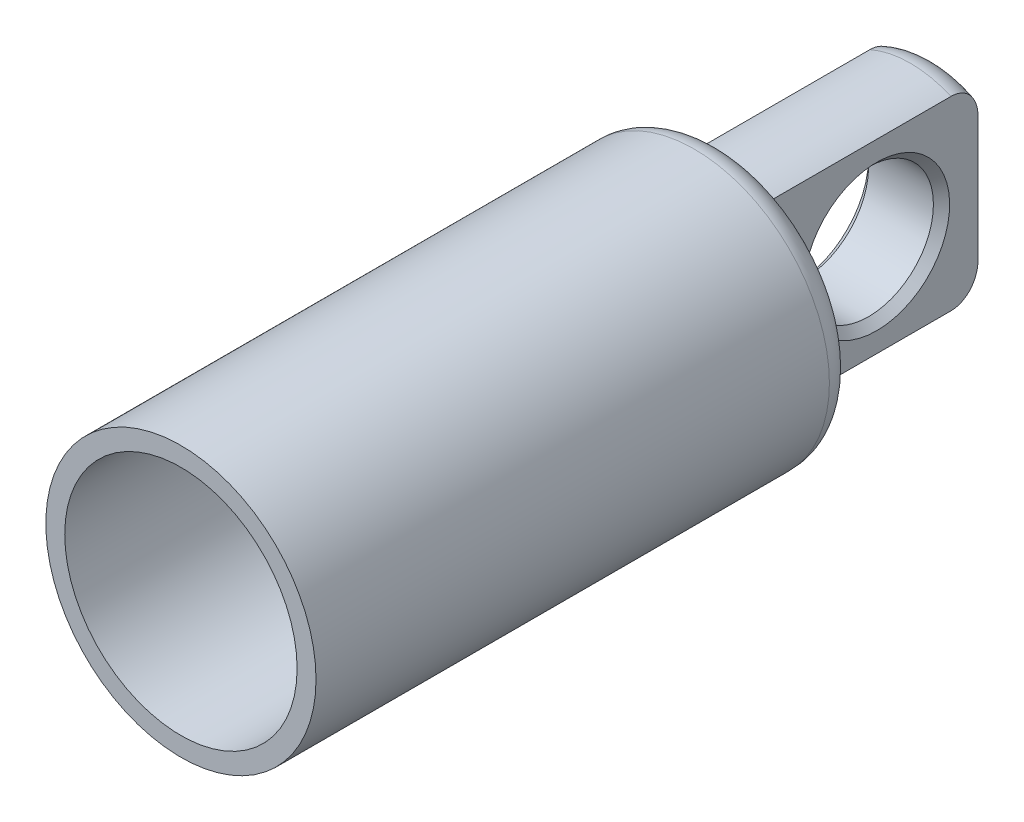
ISO-10303-21;
HEADER;
FILE_DESCRIPTION(('STEP AP214'),'2;1');
FILE_NAME('part.step','',(''),(''),'','','');
FILE_SCHEMA(('AUTOMOTIVE_DESIGN { 1 0 10303 214 1 1 1 1 }'));
ENDSEC;
DATA;
#1=APPLICATION_CONTEXT('core data for automotive mechanical design processes');
#2=APPLICATION_PROTOCOL_DEFINITION('international standard','automotive_design',2000,#1);
#3=PRODUCT_CONTEXT('',#1,'mechanical');
#4=PRODUCT('Part','Part','',(#3));
#5=PRODUCT_RELATED_PRODUCT_CATEGORY('part','',(#4));
#6=PRODUCT_DEFINITION_FORMATION('','',#4);
#7=PRODUCT_DEFINITION_CONTEXT('part definition',#1,'design');
#8=PRODUCT_DEFINITION('design','',#6,#7);
#9=PRODUCT_DEFINITION_SHAPE('','',#8);
#10=(LENGTH_UNIT() NAMED_UNIT(*) SI_UNIT(.MILLI.,.METRE.));
#11=(NAMED_UNIT(*) PLANE_ANGLE_UNIT() SI_UNIT($,.RADIAN.));
#12=(NAMED_UNIT(*) SI_UNIT($,.STERADIAN.) SOLID_ANGLE_UNIT());
#13=UNCERTAINTY_MEASURE_WITH_UNIT(LENGTH_MEASURE(1.E-05),#10,'distance_accuracy_value','');
#14=(GEOMETRIC_REPRESENTATION_CONTEXT(3) GLOBAL_UNCERTAINTY_ASSIGNED_CONTEXT((#13)) GLOBAL_UNIT_ASSIGNED_CONTEXT((#10,
#11,#12)) REPRESENTATION_CONTEXT('',''));
#15=CARTESIAN_POINT('',(0.,0.,0.));
#16=DIRECTION('',(0.,0.,1.));
#17=DIRECTION('',(1.,0.,0.));
#18=AXIS2_PLACEMENT_3D('',#15,#16,#17);
#19=CARTESIAN_POINT('',(0.,0.,-10.16));
#20=DIRECTION('',(0.,0.,1.));
#21=DIRECTION('',(1.,0.,0.));
#22=AXIS2_PLACEMENT_3D('',#19,#20,#21);
#23=CYLINDRICAL_SURFACE('',#22,4.7625);
#24=DIRECTION('',(0.,0.,-1.));
#25=VECTOR('',#24,1.);
#26=CARTESIAN_POINT('',(-1.905,-4.36490334944544,0.));
#27=LINE('',#26,#25);
#28=CARTESIAN_POINT('',(-1.905,-4.36490334944544,0.));
#29=VERTEX_POINT('',#28);
#30=CARTESIAN_POINT('',(-1.905,-4.36490334944544,-8.89));
#31=VERTEX_POINT('',#30);
#32=EDGE_CURVE('E207',#29,#31,#27,.T.);
#33=ORIENTED_EDGE('',*,*,#32,.T.);
#34=CARTESIAN_POINT('',(0.,0.,-8.89));
#35=DIRECTION('',(0.,0.,-1.));
#36=DIRECTION('',(-1.,0.,0.));
#37=AXIS2_PLACEMENT_3D('',#34,#35,#36);
#38=CIRCLE('',#37,4.7625);
#39=CARTESIAN_POINT('',(1.905,-4.36490334944544,-8.89));
#40=VERTEX_POINT('',#39);
#41=EDGE_CURVE('E60',#31,#40,#38,.F.);
#42=ORIENTED_EDGE('',*,*,#41,.T.);
#43=DIRECTION('',(0.,0.,-1.));
#44=VECTOR('',#43,1.);
#45=CARTESIAN_POINT('',(1.905,-4.36490334944544,0.));
#46=LINE('',#45,#44);
#47=CARTESIAN_POINT('',(1.905,-4.36490334944544,0.));
#48=VERTEX_POINT('',#47);
#49=EDGE_CURVE('E91',#48,#40,#46,.T.);
#50=ORIENTED_EDGE('',*,*,#49,.F.);
#51=CARTESIAN_POINT('',(0.,0.,0.));
#52=DIRECTION('',(0.,0.,1.));
#53=DIRECTION('',(1.,0.,0.));
#54=AXIS2_PLACEMENT_3D('',#51,#52,#53);
#55=CIRCLE('',#54,4.7625);
#56=EDGE_CURVE('E101',#48,#29,#55,.F.);
#57=ORIENTED_EDGE('',*,*,#56,.T.);
#58=EDGE_LOOP('',(#33,#42,#50,#57));
#59=FACE_BOUND('',#58,.T.);
#60=ADVANCED_FACE('F36',(#59),#23,.T.);
#61=CARTESIAN_POINT('',(0.,0.,25.4));
#62=DIRECTION('',(0.,0.,-1.));
#63=DIRECTION('',(-1.,0.,0.));
#64=AXIS2_PLACEMENT_3D('',#61,#62,#63);
#65=CYLINDRICAL_SURFACE('',#64,6.35);
#66=CARTESIAN_POINT('',(0.,0.,1.27));
#67=DIRECTION('',(0.,0.,1.));
#68=DIRECTION('',(1.,0.,0.));
#69=AXIS2_PLACEMENT_3D('',#66,#67,#68);
#70=CIRCLE('',#69,6.35);
#71=CARTESIAN_POINT('',(6.35,0.,1.27));
#72=VERTEX_POINT('',#71);
#73=EDGE_CURVE('E230',#72,#72,#70,.T.);
#74=ORIENTED_EDGE('',*,*,#73,.T.);
#75=EDGE_LOOP('',(#74));
#76=FACE_BOUND('',#75,.T.);
#77=CARTESIAN_POINT('',(0.,0.,25.4));
#78=DIRECTION('',(0.,0.,1.));
#79=DIRECTION('',(1.,0.,0.));
#80=AXIS2_PLACEMENT_3D('',#77,#78,#79);
#81=CIRCLE('',#80,6.35);
#82=CARTESIAN_POINT('',(6.35,0.,25.4));
#83=VERTEX_POINT('',#82);
#84=EDGE_CURVE('E228',#83,#83,#81,.T.);
#85=ORIENTED_EDGE('',*,*,#84,.F.);
#86=EDGE_LOOP('',(#85));
#87=FACE_BOUND('',#86,.T.);
#88=ADVANCED_FACE('F173',(#76,#87),#65,.T.);
#89=CARTESIAN_POINT('',(0.,0.,25.4));
#90=DIRECTION('',(0.,0.,1.));
#91=DIRECTION('',(1.,0.,0.));
#92=AXIS2_PLACEMENT_3D('',#89,#90,#91);
#93=PLANE('',#92);
#94=CARTESIAN_POINT('',(0.,0.,25.4));
#95=DIRECTION('',(0.,0.,1.));
#96=DIRECTION('',(1.,0.,0.));
#97=AXIS2_PLACEMENT_3D('',#94,#95,#96);
#98=CIRCLE('',#97,5.461);
#99=CARTESIAN_POINT('',(5.461,0.,25.4));
#100=VERTEX_POINT('',#99);
#101=EDGE_CURVE('E225',#100,#100,#98,.T.);
#102=ORIENTED_EDGE('',*,*,#101,.F.);
#103=EDGE_LOOP('',(#102));
#104=FACE_BOUND('',#103,.T.);
#105=ORIENTED_EDGE('',*,*,#84,.T.);
#106=EDGE_LOOP('',(#105));
#107=FACE_BOUND('',#106,.T.);
#108=ADVANCED_FACE('F170',(#104,#107),#93,.T.);
#109=CARTESIAN_POINT('',(0.,0.,0.));
#110=DIRECTION('',(0.,0.,1.));
#111=DIRECTION('',(1.,0.,0.));
#112=AXIS2_PLACEMENT_3D('',#109,#110,#111);
#113=PLANE('',#112);
#114=ORIENTED_EDGE('',*,*,#56,.F.);
#115=DIRECTION('',(0.,1.,0.));
#116=VECTOR('',#115,1.);
#117=CARTESIAN_POINT('',(1.905,4.36490334944544,0.));
#118=LINE('',#117,#116);
#119=CARTESIAN_POINT('',(1.905,4.36490334944544,0.));
#120=VERTEX_POINT('',#119);
#121=EDGE_CURVE('E89',#48,#120,#118,.T.);
#122=ORIENTED_EDGE('',*,*,#121,.T.);
#123=CARTESIAN_POINT('',(-1.905,4.36490334944544,0.));
#124=VERTEX_POINT('',#123);
#125=EDGE_CURVE('E108',#124,#120,#55,.F.);
#126=ORIENTED_EDGE('',*,*,#125,.F.);
#127=DIRECTION('',(0.,-1.,0.));
#128=VECTOR('',#127,1.);
#129=CARTESIAN_POINT('',(-1.905,4.36490334944544,0.));
#130=LINE('',#129,#128);
#131=EDGE_CURVE('E106',#124,#29,#130,.T.);
#132=ORIENTED_EDGE('',*,*,#131,.T.);
#133=EDGE_LOOP('',(#114,#122,#126,#132));
#134=FACE_BOUND('',#133,.T.);
#135=CARTESIAN_POINT('',(0.,0.,0.));
#136=DIRECTION('',(0.,0.,1.));
#137=DIRECTION('',(1.,0.,0.));
#138=AXIS2_PLACEMENT_3D('',#135,#136,#137);
#139=CIRCLE('',#138,5.08);
#140=CARTESIAN_POINT('',(5.08,0.,0.));
#141=VERTEX_POINT('',#140);
#142=EDGE_CURVE('E113',#141,#141,#139,.F.);
#143=ORIENTED_EDGE('',*,*,#142,.T.);
#144=EDGE_LOOP('',(#143));
#145=FACE_BOUND('',#144,.T.);
#146=ADVANCED_FACE('F104',(#134,#145),#113,.F.);
#147=CARTESIAN_POINT('',(0.,0.,25.4));
#148=DIRECTION('',(0.,0.,-1.));
#149=DIRECTION('',(-1.,0.,0.));
#150=AXIS2_PLACEMENT_3D('',#147,#148,#149);
#151=CYLINDRICAL_SURFACE('',#150,5.461);
#152=ORIENTED_EDGE('',*,*,#101,.T.);
#153=EDGE_LOOP('',(#152));
#154=FACE_BOUND('',#153,.T.);
#155=CARTESIAN_POINT('',(0.,0.,0.889000000000001));
#156=DIRECTION('',(0.,0.,1.));
#157=DIRECTION('',(1.,0.,0.));
#158=AXIS2_PLACEMENT_3D('',#155,#156,#157);
#159=CIRCLE('',#158,5.461);
#160=CARTESIAN_POINT('',(5.461,0.,0.889000000000001));
#161=VERTEX_POINT('',#160);
#162=EDGE_CURVE('E217',#161,#161,#159,.T.);
#163=ORIENTED_EDGE('',*,*,#162,.F.);
#164=EDGE_LOOP('',(#163));
#165=FACE_BOUND('',#164,.T.);
#166=ADVANCED_FACE('F162',(#154,#165),#151,.F.);
#167=CARTESIAN_POINT('',(0.,0.,0.889));
#168=DIRECTION('',(0.,0.,1.));
#169=DIRECTION('',(1.,0.,0.));
#170=AXIS2_PLACEMENT_3D('',#167,#168,#169);
#171=PLANE('',#170);
#172=ORIENTED_EDGE('',*,*,#162,.T.);
#173=EDGE_LOOP('',(#172));
#174=FACE_BOUND('',#173,.T.);
#175=ADVANCED_FACE('F165',(#174),#171,.T.);
#176=CARTESIAN_POINT('',(0.,0.,1.27));
#177=DIRECTION('',(0.,0.,1.));
#178=DIRECTION('',(1.,0.,0.));
#179=AXIS2_PLACEMENT_3D('',#176,#177,#178);
#180=TOROIDAL_SURFACE('',#179,5.08,1.27);
#181=ORIENTED_EDGE('',*,*,#142,.F.);
#182=EDGE_LOOP('',(#181));
#183=FACE_BOUND('',#182,.T.);
#184=ORIENTED_EDGE('',*,*,#73,.F.);
#185=EDGE_LOOP('',(#184));
#186=FACE_BOUND('',#185,.T.);
#187=ADVANCED_FACE('F160',(#183,#186),#180,.T.);
#188=DIRECTION('',(0.,0.,-1.));
#189=VECTOR('',#188,1.);
#190=CARTESIAN_POINT('',(1.905,4.36490334944544,0.));
#191=LINE('',#190,#189);
#192=CARTESIAN_POINT('',(1.905,4.36490334944544,-8.89));
#193=VERTEX_POINT('',#192);
#194=EDGE_CURVE('E93',#120,#193,#191,.T.);
#195=ORIENTED_EDGE('',*,*,#194,.T.);
#196=CARTESIAN_POINT('',(0.,0.,-8.89));
#197=DIRECTION('',(0.,0.,-1.));
#198=DIRECTION('',(-1.,0.,0.));
#199=AXIS2_PLACEMENT_3D('',#196,#197,#198);
#200=CIRCLE('',#199,4.7625);
#201=CARTESIAN_POINT('',(-1.905,4.36490334944544,-8.89));
#202=VERTEX_POINT('',#201);
#203=EDGE_CURVE('E11',#193,#202,#200,.F.);
#204=ORIENTED_EDGE('',*,*,#203,.T.);
#205=DIRECTION('',(0.,0.,-1.));
#206=VECTOR('',#205,1.);
#207=CARTESIAN_POINT('',(-1.905,4.36490334944544,0.));
#208=LINE('',#207,#206);
#209=EDGE_CURVE('E211',#124,#202,#208,.T.);
#210=ORIENTED_EDGE('',*,*,#209,.F.);
#211=ORIENTED_EDGE('',*,*,#125,.T.);
#212=EDGE_LOOP('',(#195,#204,#210,#211));
#213=FACE_BOUND('',#212,.T.);
#214=ADVANCED_FACE('F156',(#213),#23,.T.);
#215=CARTESIAN_POINT('',(0.,0.,-10.16));
#216=DIRECTION('',(0.,0.,-1.));
#217=DIRECTION('',(-1.,0.,0.));
#218=AXIS2_PLACEMENT_3D('',#215,#216,#217);
#219=PLANE('',#218);
#220=DIRECTION('',(0.,1.,0.));
#221=VECTOR('',#220,1.);
#222=CARTESIAN_POINT('',(1.905,4.36490334944544,-10.16));
#223=LINE('',#222,#221);
#224=CARTESIAN_POINT('',(1.905,-2.92720536519049,-10.16));
#225=VERTEX_POINT('',#224);
#226=CARTESIAN_POINT('',(1.905,2.92720536519049,-10.16));
#227=VERTEX_POINT('',#226);
#228=EDGE_CURVE('E98',#225,#227,#223,.T.);
#229=ORIENTED_EDGE('',*,*,#228,.F.);
#230=CARTESIAN_POINT('',(0.,0.,-10.16));
#231=DIRECTION('',(0.,0.,-1.));
#232=DIRECTION('',(-1.,0.,0.));
#233=AXIS2_PLACEMENT_3D('',#230,#231,#232);
#234=CIRCLE('',#233,3.4925);
#235=CARTESIAN_POINT('',(-1.905,-2.92720536519049,-10.16));
#236=VERTEX_POINT('',#235);
#237=EDGE_CURVE('E128',#225,#236,#234,.T.);
#238=ORIENTED_EDGE('',*,*,#237,.T.);
#239=DIRECTION('',(0.,-1.,0.));
#240=VECTOR('',#239,1.);
#241=CARTESIAN_POINT('',(-1.905,4.36490334944544,-10.16));
#242=LINE('',#241,#240);
#243=CARTESIAN_POINT('',(-1.905,2.92720536519049,-10.16));
#244=VERTEX_POINT('',#243);
#245=EDGE_CURVE('E209',#244,#236,#242,.T.);
#246=ORIENTED_EDGE('',*,*,#245,.F.);
#247=CARTESIAN_POINT('',(0.,0.,-10.16));
#248=DIRECTION('',(0.,0.,-1.));
#249=DIRECTION('',(-1.,0.,0.));
#250=AXIS2_PLACEMENT_3D('',#247,#248,#249);
#251=CIRCLE('',#250,3.4925);
#252=EDGE_CURVE('E125',#244,#227,#251,.T.);
#253=ORIENTED_EDGE('',*,*,#252,.T.);
#254=EDGE_LOOP('',(#229,#238,#246,#253));
#255=FACE_BOUND('',#254,.T.);
#256=ADVANCED_FACE('F149',(#255),#219,.T.);
#257=CARTESIAN_POINT('',(-1.905,4.36490334944544,0.));
#258=DIRECTION('',(1.,0.,0.));
#259=DIRECTION('',(0.,1.,0.));
#260=AXIS2_PLACEMENT_3D('',#257,#258,#259);
#261=PLANE('',#260);
#262=CARTESIAN_POINT('',(-1.905,0.,-5.3975));
#263=DIRECTION('',(1.,0.,0.));
#264=DIRECTION('',(0.,1.,0.));
#265=AXIS2_PLACEMENT_3D('',#262,#263,#264);
#266=CIRCLE('',#265,3.429);
#267=CARTESIAN_POINT('',(-1.905,3.429,-5.3975));
#268=VERTEX_POINT('',#267);
#269=EDGE_CURVE('E107',#268,#268,#266,.T.);
#270=ORIENTED_EDGE('',*,*,#269,.T.);
#271=EDGE_LOOP('',(#270));
#272=FACE_BOUND('',#271,.T.);
#273=ORIENTED_EDGE('',*,*,#245,.T.);
#274=CARTESIAN_POINT('',(-1.905,-2.92720536519049,-10.16));
#275=CARTESIAN_POINT('',(-1.905,-2.98132402105541,-10.1600064832095));
#276=CARTESIAN_POINT('',(-1.905,-3.03546640915894,-10.1575694277126));
#277=CARTESIAN_POINT('',(-1.905,-3.14337038378051,-10.147600787364));
#278=CARTESIAN_POINT('',(-1.905,-3.19713115345611,-10.1400604319878));
#279=CARTESIAN_POINT('',(-1.905,-3.30381074626772,-10.1196462465851));
#280=CARTESIAN_POINT('',(-1.905,-3.35672661587625,-10.1067567396132));
#281=CARTESIAN_POINT('',(-1.905,-3.46087340765745,-10.0755358837916));
#282=CARTESIAN_POINT('',(-1.905,-3.51210576523154,-10.0572093118652));
#283=CARTESIAN_POINT('',(-1.905,-3.63377839124686,-10.0059866506064));
#284=CARTESIAN_POINT('',(-1.905,-3.70303952694985,-9.97021263677757));
#285=CARTESIAN_POINT('',(-1.905,-3.83451020752514,-9.88771868456725));
#286=CARTESIAN_POINT('',(-1.905,-3.89673567753279,-9.84102423131769));
#287=CARTESIAN_POINT('',(-1.905,-4.01235640306473,-9.73713293052762));
#288=CARTESIAN_POINT('',(-1.905,-4.06570386564284,-9.67988252894815));
#289=CARTESIAN_POINT('',(-1.905,-4.16092021285018,-9.55641047586642));
#290=CARTESIAN_POINT('',(-1.905,-4.20278291350322,-9.49018401976242));
#291=CARTESIAN_POINT('',(-1.905,-4.26985685386264,-9.35715368823077));
#292=CARTESIAN_POINT('',(-1.905,-4.29622038509427,-9.29092834996992));
#293=CARTESIAN_POINT('',(-1.905,-4.33658892991174,-9.15489125363754));
#294=CARTESIAN_POINT('',(-1.905,-4.35062151379467,-9.0850878676247));
#295=CARTESIAN_POINT('',(-1.905,-4.36043965484168,-8.99397786798046));
#296=CARTESIAN_POINT('',(-1.905,-4.36211401183235,-8.9732011982541));
#297=CARTESIAN_POINT('',(-1.905,-4.36434422473604,-8.93161949765128));
#298=CARTESIAN_POINT('',(-1.905,-4.36490177407431,-8.91081455765388));
#299=CARTESIAN_POINT('',(-1.905,-4.36490334944546,-8.89));
#300=B_SPLINE_CURVE_WITH_KNOTS('',3,(#274,#275,#276,#277,#278,#279,#280,#281,#282,#283,#284,
#285,#286,#287,#288,#289,#290,#291,#292,#293,#294,#295,#296,#297,#298,#299),.UNSPECIFIED.,.F.,
.F.,(4,2,2,2,2,2,2,2,2,2,2,2,4),(0.,0.162335826820369,0.324951354612323,0.488046869242433,
0.650999512834123,0.883796058421268,1.11605465223082,1.34952572611191,1.58312226697818,
1.79588027556207,2.00816136727746,2.07067322340408,2.13309022028259),.UNSPECIFIED.);
#301=EDGE_CURVE('E138',#236,#31,#300,.T.);
#302=ORIENTED_EDGE('',*,*,#301,.T.);
#303=ORIENTED_EDGE('',*,*,#32,.F.);
#304=ORIENTED_EDGE('',*,*,#131,.F.);
#305=ORIENTED_EDGE('',*,*,#209,.T.);
#306=CARTESIAN_POINT('',(-1.905,4.36490334944544,-8.89));
#307=CARTESIAN_POINT('',(-1.905,4.36490422359483,-8.92339919910838));
#308=CARTESIAN_POINT('',(-1.905,4.36346480508041,-8.95678177763765));
#309=CARTESIAN_POINT('',(-1.905,4.35772999076058,-9.02329490045136));
#310=CARTESIAN_POINT('',(-1.905,4.35343509534946,-9.05642548786607));
#311=CARTESIAN_POINT('',(-1.905,4.33634337546593,-9.15489806950019));
#312=CARTESIAN_POINT('',(-1.905,4.31933911241619,-9.21955802636618));
#313=CARTESIAN_POINT('',(-1.905,4.27475667885088,-9.34506168882081));
#314=CARTESIAN_POINT('',(-1.905,4.24717995463365,-9.40590591507211));
#315=CARTESIAN_POINT('',(-1.905,4.1824556513036,-9.52228788782987));
#316=CARTESIAN_POINT('',(-1.905,4.14530451663396,-9.57782365245797));
#317=CARTESIAN_POINT('',(-1.905,4.06158354676759,-9.6837275420454));
#318=CARTESIAN_POINT('',(-1.905,4.01478585752914,-9.73391495783361));
#319=CARTESIAN_POINT('',(-1.905,3.91397899782167,-9.8263799471498));
#320=CARTESIAN_POINT('',(-1.905,3.85996996730527,-9.8686576741452));
#321=CARTESIAN_POINT('',(-1.905,3.74194657661533,-9.94764916451322));
#322=CARTESIAN_POINT('',(-1.905,3.6774828837546,-9.98368986955687));
#323=CARTESIAN_POINT('',(-1.905,3.54380992591659,-10.0457069429606));
#324=CARTESIAN_POINT('',(-1.905,3.47459377568292,-10.0716683304353));
#325=CARTESIAN_POINT('',(-1.905,3.32657767116101,-10.1155078617819));
#326=CARTESIAN_POINT('',(-1.905,3.2474882057244,-10.1323976470139));
#327=CARTESIAN_POINT('',(-1.905,3.08795205769954,-10.1546476910731));
#328=CARTESIAN_POINT('',(-1.905,3.0075107274282,-10.1600458876112));
#329=CARTESIAN_POINT('',(-1.905,2.92720536519049,-10.16));
#330=B_SPLINE_CURVE_WITH_KNOTS('',3,(#306,#307,#308,#309,#310,#311,#312,#313,#314,#315,#316,
#317,#318,#319,#320,#321,#322,#323,#324,#325,#326,#327,#328,#329),.UNSPECIFIED.,.F.,.F.,(4,2,2,
2,2,2,2,2,2,2,2,4),(0.,0.100133888262804,0.20025023366848,0.399780863197951,0.599284206941912,
0.79886174535297,1.00384490895569,1.20882409496814,1.42948410837142,1.65047084446328,
1.89221565367468,2.13316113395296),.UNSPECIFIED.);
#331=EDGE_CURVE('E131',#202,#244,#330,.T.);
#332=ORIENTED_EDGE('',*,*,#331,.T.);
#333=EDGE_LOOP('',(#273,#302,#303,#304,#305,#332));
#334=FACE_BOUND('',#333,.T.);
#335=ADVANCED_FACE('F144',(#272,#334),#261,.F.);
#336=CARTESIAN_POINT('',(1.905,4.36490334944544,0.));
#337=DIRECTION('',(-1.,0.,0.));
#338=DIRECTION('',(0.,-1.,0.));
#339=AXIS2_PLACEMENT_3D('',#336,#337,#338);
#340=PLANE('',#339);
#341=CARTESIAN_POINT('',(1.905,0.,-5.3975));
#342=DIRECTION('',(-1.,0.,0.));
#343=DIRECTION('',(0.,-1.,0.));
#344=AXIS2_PLACEMENT_3D('',#341,#342,#343);
#345=CIRCLE('',#344,3.42900000000001);
#346=CARTESIAN_POINT('',(1.905,-3.42900000000001,-5.3975));
#347=VERTEX_POINT('',#346);
#348=EDGE_CURVE('E122',#347,#347,#345,.T.);
#349=ORIENTED_EDGE('',*,*,#348,.T.);
#350=EDGE_LOOP('',(#349));
#351=FACE_BOUND('',#350,.T.);
#352=ORIENTED_EDGE('',*,*,#49,.T.);
#353=CARTESIAN_POINT('',(1.905,-4.36490334944544,-8.89));
#354=CARTESIAN_POINT('',(1.905,-4.36490422359483,-8.92339919910838));
#355=CARTESIAN_POINT('',(1.905,-4.36346480508041,-8.95678177763766));
#356=CARTESIAN_POINT('',(1.905,-4.35772999076058,-9.02329490045136));
#357=CARTESIAN_POINT('',(1.905,-4.35343509534946,-9.05642548786607));
#358=CARTESIAN_POINT('',(1.905,-4.33634337546593,-9.15489806950019));
#359=CARTESIAN_POINT('',(1.905,-4.31933911241619,-9.21955802636618));
#360=CARTESIAN_POINT('',(1.905,-4.27475667885088,-9.34506168882081));
#361=CARTESIAN_POINT('',(1.905,-4.24717995463365,-9.40590591507211));
#362=CARTESIAN_POINT('',(1.905,-4.1824556513036,-9.52228788782987));
#363=CARTESIAN_POINT('',(1.905,-4.14530451663395,-9.57782365245797));
#364=CARTESIAN_POINT('',(1.905,-4.06158354676759,-9.6837275420454));
#365=CARTESIAN_POINT('',(1.905,-4.01478585752914,-9.73391495783361));
#366=CARTESIAN_POINT('',(1.905,-3.91397899782167,-9.8263799471498));
#367=CARTESIAN_POINT('',(1.905,-3.85996996730528,-9.8686576741452));
#368=CARTESIAN_POINT('',(1.905,-3.74194657661533,-9.94764916451322));
#369=CARTESIAN_POINT('',(1.905,-3.6774828837546,-9.98368986955687));
#370=CARTESIAN_POINT('',(1.905,-3.54380992591659,-10.0457069429606));
#371=CARTESIAN_POINT('',(1.905,-3.47459377568293,-10.0716683304353));
#372=CARTESIAN_POINT('',(1.905,-3.32657767116101,-10.1155078617819));
#373=CARTESIAN_POINT('',(1.905,-3.2474882057244,-10.1323976470139));
#374=CARTESIAN_POINT('',(1.905,-3.08795205769954,-10.1546476910731));
#375=CARTESIAN_POINT('',(1.905,-3.0075107274282,-10.1600458876112));
#376=CARTESIAN_POINT('',(1.905,-2.92720536519049,-10.16));
#377=B_SPLINE_CURVE_WITH_KNOTS('',3,(#353,#354,#355,#356,#357,#358,#359,#360,#361,#362,#363,
#364,#365,#366,#367,#368,#369,#370,#371,#372,#373,#374,#375,#376),.UNSPECIFIED.,.F.,.F.,(4,2,2,
2,2,2,2,2,2,2,2,4),(0.,0.100133888262806,0.200250233668484,0.399780863197951,0.599284206941912,
0.798861745352971,1.00384490895569,1.20882409496814,1.42948410837142,1.65047084446328,
1.89221565367468,2.13316113395296),.UNSPECIFIED.);
#378=EDGE_CURVE('E45',#40,#225,#377,.T.);
#379=ORIENTED_EDGE('',*,*,#378,.T.);
#380=ORIENTED_EDGE('',*,*,#228,.T.);
#381=CARTESIAN_POINT('',(1.905,2.92720536519049,-10.16));
#382=CARTESIAN_POINT('',(1.905,2.98132402105541,-10.1600064832095));
#383=CARTESIAN_POINT('',(1.905,3.03546640915894,-10.1575694277126));
#384=CARTESIAN_POINT('',(1.905,3.14337038378051,-10.147600787364));
#385=CARTESIAN_POINT('',(1.905,3.19713115345611,-10.1400604319878));
#386=CARTESIAN_POINT('',(1.905,3.30381074626772,-10.1196462465851));
#387=CARTESIAN_POINT('',(1.905,3.35672661587625,-10.1067567396132));
#388=CARTESIAN_POINT('',(1.905,3.46087340765745,-10.0755358837916));
#389=CARTESIAN_POINT('',(1.905,3.51210576523154,-10.0572093118652));
#390=CARTESIAN_POINT('',(1.905,3.63377839124686,-10.0059866506064));
#391=CARTESIAN_POINT('',(1.905,3.70303952694985,-9.97021263677757));
#392=CARTESIAN_POINT('',(1.905,3.83451020752514,-9.88771868456725));
#393=CARTESIAN_POINT('',(1.905,3.89673567753279,-9.84102423131769));
#394=CARTESIAN_POINT('',(1.905,4.01235640306473,-9.73713293052762));
#395=CARTESIAN_POINT('',(1.905,4.06570386564284,-9.67988252894815));
#396=CARTESIAN_POINT('',(1.905,4.16092021285018,-9.55641047586642));
#397=CARTESIAN_POINT('',(1.905,4.20278291350322,-9.49018401976242));
#398=CARTESIAN_POINT('',(1.905,4.26985685386264,-9.35715368823077));
#399=CARTESIAN_POINT('',(1.905,4.29622038509427,-9.29092834996992));
#400=CARTESIAN_POINT('',(1.905,4.33658892991174,-9.15489125363754));
#401=CARTESIAN_POINT('',(1.905,4.35062151379467,-9.0850878676247));
#402=CARTESIAN_POINT('',(1.905,4.36043965484168,-8.99397786798046));
#403=CARTESIAN_POINT('',(1.905,4.36211401183235,-8.9732011982541));
#404=CARTESIAN_POINT('',(1.905,4.36434422473604,-8.93161949765128));
#405=CARTESIAN_POINT('',(1.905,4.36490177407431,-8.91081455765388));
#406=CARTESIAN_POINT('',(1.905,4.36490334944546,-8.89));
#407=B_SPLINE_CURVE_WITH_KNOTS('',3,(#381,#382,#383,#384,#385,#386,#387,#388,#389,#390,#391,
#392,#393,#394,#395,#396,#397,#398,#399,#400,#401,#402,#403,#404,#405,#406),.UNSPECIFIED.,.F.,
.F.,(4,2,2,2,2,2,2,2,2,2,2,2,4),(0.,0.162335826820369,0.324951354612323,0.488046869242433,
0.650999512834123,0.883796058421268,1.11605465223082,1.34952572611191,1.58312226697818,
1.79588027556207,2.00816136727746,2.07067322340408,2.13309022028259),.UNSPECIFIED.);
#408=EDGE_CURVE('E52',#227,#193,#407,.T.);
#409=ORIENTED_EDGE('',*,*,#408,.T.);
#410=ORIENTED_EDGE('',*,*,#194,.F.);
#411=ORIENTED_EDGE('',*,*,#121,.F.);
#412=EDGE_LOOP('',(#352,#379,#380,#409,#410,#411));
#413=FACE_BOUND('',#412,.T.);
#414=ADVANCED_FACE('F90',(#351,#413),#340,.F.);
#415=CARTESIAN_POINT('',(-6.35,0.,-5.3975));
#416=DIRECTION('',(1.,0.,0.));
#417=DIRECTION('',(0.,1.,0.));
#418=AXIS2_PLACEMENT_3D('',#415,#416,#417);
#419=CYLINDRICAL_SURFACE('',#418,3.048);
#420=CARTESIAN_POINT('',(-1.524,0.,-5.3975));
#421=DIRECTION('',(1.,0.,0.));
#422=DIRECTION('',(0.,1.,0.));
#423=AXIS2_PLACEMENT_3D('',#420,#421,#422);
#424=CIRCLE('',#423,3.048);
#425=CARTESIAN_POINT('',(-1.524,3.048,-5.3975));
#426=VERTEX_POINT('',#425);
#427=EDGE_CURVE('E119',#426,#426,#424,.F.);
#428=ORIENTED_EDGE('',*,*,#427,.T.);
#429=EDGE_LOOP('',(#428));
#430=FACE_BOUND('',#429,.T.);
#431=CARTESIAN_POINT('',(1.52399999999999,0.,-5.3975));
#432=DIRECTION('',(-1.,0.,0.));
#433=DIRECTION('',(0.,-1.,0.));
#434=AXIS2_PLACEMENT_3D('',#431,#432,#433);
#435=CIRCLE('',#434,3.048);
#436=CARTESIAN_POINT('',(1.52399999999999,-3.048,-5.3975));
#437=VERTEX_POINT('',#436);
#438=EDGE_CURVE('E111',#437,#437,#435,.F.);
#439=ORIENTED_EDGE('',*,*,#438,.T.);
#440=EDGE_LOOP('',(#439));
#441=FACE_BOUND('',#440,.T.);
#442=ADVANCED_FACE('F187',(#430,#441),#419,.F.);
#443=CARTESIAN_POINT('',(-1.905,0.,-5.3975));
#444=DIRECTION('',(-1.,0.,0.));
#445=DIRECTION('',(0.,-1.,0.));
#446=AXIS2_PLACEMENT_3D('',#443,#444,#445);
#447=CONICAL_SURFACE('',#446,3.429,0.785398163397449);
#448=ORIENTED_EDGE('',*,*,#427,.F.);
#449=EDGE_LOOP('',(#448));
#450=FACE_BOUND('',#449,.T.);
#451=ORIENTED_EDGE('',*,*,#269,.F.);
#452=EDGE_LOOP('',(#451));
#453=FACE_BOUND('',#452,.T.);
#454=ADVANCED_FACE('F183',(#450,#453),#447,.F.);
#455=CARTESIAN_POINT('',(1.905,0.,-5.3975));
#456=DIRECTION('',(1.,0.,0.));
#457=DIRECTION('',(0.,1.,0.));
#458=AXIS2_PLACEMENT_3D('',#455,#456,#457);
#459=CONICAL_SURFACE('',#458,3.42900000000001,0.785398163397447);
#460=ORIENTED_EDGE('',*,*,#438,.F.);
#461=EDGE_LOOP('',(#460));
#462=FACE_BOUND('',#461,.T.);
#463=ORIENTED_EDGE('',*,*,#348,.F.);
#464=EDGE_LOOP('',(#463));
#465=FACE_BOUND('',#464,.T.);
#466=ADVANCED_FACE('F186',(#462,#465),#459,.F.);
#467=CARTESIAN_POINT('',(0.,0.,-8.89));
#468=DIRECTION('',(0.,0.,-1.));
#469=DIRECTION('',(-1.,0.,0.));
#470=AXIS2_PLACEMENT_3D('',#467,#468,#469);
#471=TOROIDAL_SURFACE('',#470,3.4925,1.27);
#472=ORIENTED_EDGE('',*,*,#378,.F.);
#473=ORIENTED_EDGE('',*,*,#41,.F.);
#474=ORIENTED_EDGE('',*,*,#301,.F.);
#475=ORIENTED_EDGE('',*,*,#237,.F.);
#476=EDGE_LOOP('',(#472,#473,#474,#475));
#477=FACE_BOUND('',#476,.T.);
#478=ADVANCED_FACE('F190',(#477),#471,.T.);
#479=CARTESIAN_POINT('',(0.,0.,-8.89));
#480=DIRECTION('',(0.,0.,-1.));
#481=DIRECTION('',(-1.,0.,0.));
#482=AXIS2_PLACEMENT_3D('',#479,#480,#481);
#483=TOROIDAL_SURFACE('',#482,3.4925,1.27);
#484=ORIENTED_EDGE('',*,*,#331,.F.);
#485=ORIENTED_EDGE('',*,*,#203,.F.);
#486=ORIENTED_EDGE('',*,*,#408,.F.);
#487=ORIENTED_EDGE('',*,*,#252,.F.);
#488=EDGE_LOOP('',(#484,#485,#486,#487));
#489=FACE_BOUND('',#488,.T.);
#490=ADVANCED_FACE('F38',(#489),#483,.T.);
#491=CLOSED_SHELL('',(#60,#88,#108,#146,#166,#175,#187,#214,#256,#335,#414,#442,#454,#466,#478,#490));
#492=MANIFOLD_SOLID_BREP('B2',#491);
#493=ADVANCED_BREP_SHAPE_REPRESENTATION('',(#18,#492),#14);
#494=SHAPE_DEFINITION_REPRESENTATION(#9,#493);
ENDSEC;
END-ISO-10303-21;
